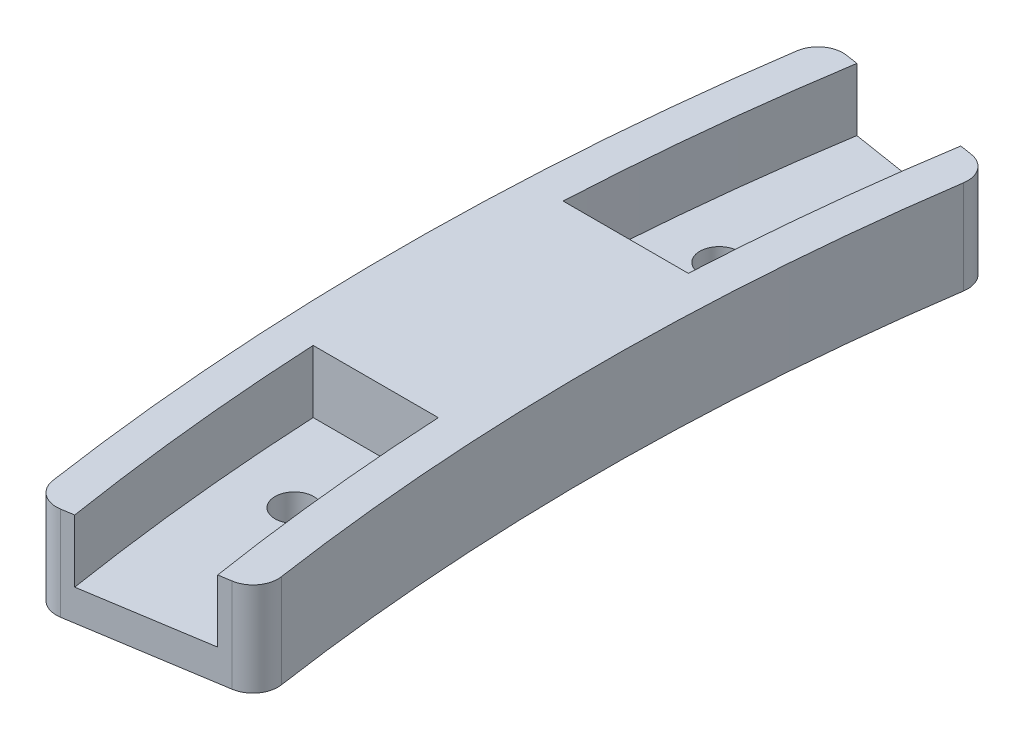
ISO-10303-21;
HEADER;
FILE_DESCRIPTION(('STEP AP214'),'2;1');
FILE_NAME('part.step','',(''),(''),'','','');
FILE_SCHEMA(('AUTOMOTIVE_DESIGN { 1 0 10303 214 1 1 1 1 }'));
ENDSEC;
DATA;
#1=APPLICATION_CONTEXT('core data for automotive mechanical design processes');
#2=APPLICATION_PROTOCOL_DEFINITION('international standard','automotive_design',2000,#1);
#3=PRODUCT_CONTEXT('',#1,'mechanical');
#4=PRODUCT('Part','Part','',(#3));
#5=PRODUCT_RELATED_PRODUCT_CATEGORY('part','',(#4));
#6=PRODUCT_DEFINITION_FORMATION('','',#4);
#7=PRODUCT_DEFINITION_CONTEXT('part definition',#1,'design');
#8=PRODUCT_DEFINITION('design','',#6,#7);
#9=PRODUCT_DEFINITION_SHAPE('','',#8);
#10=(LENGTH_UNIT() NAMED_UNIT(*) SI_UNIT(.MILLI.,.METRE.));
#11=(NAMED_UNIT(*) PLANE_ANGLE_UNIT() SI_UNIT($,.RADIAN.));
#12=(NAMED_UNIT(*) SI_UNIT($,.STERADIAN.) SOLID_ANGLE_UNIT());
#13=UNCERTAINTY_MEASURE_WITH_UNIT(LENGTH_MEASURE(1.E-05),#10,'distance_accuracy_value','');
#14=(GEOMETRIC_REPRESENTATION_CONTEXT(3) GLOBAL_UNCERTAINTY_ASSIGNED_CONTEXT((#13)) GLOBAL_UNIT_ASSIGNED_CONTEXT((#10,
#11,#12)) REPRESENTATION_CONTEXT('',''));
#15=CARTESIAN_POINT('',(0.,0.,0.));
#16=DIRECTION('',(0.,0.,1.));
#17=DIRECTION('',(1.,0.,0.));
#18=AXIS2_PLACEMENT_3D('',#15,#16,#17);
#19=CARTESIAN_POINT('',(0.,10.,0.));
#20=DIRECTION('',(0.156434465040231,0.,0.987688340595138));
#21=DIRECTION('',(0.987688340595138,0.,-0.156434465040231));
#22=AXIS2_PLACEMENT_3D('',#19,#20,#21);
#23=PLANE('',#22);
#24=DIRECTION('',(0.,1.,0.));
#25=VECTOR('',#24,1.);
#26=CARTESIAN_POINT('',(-198.515528471673,0.,31.4417708727155));
#27=LINE('',#26,#25);
#28=CARTESIAN_POINT('',(-198.515528471673,10.,31.4417708727155));
#29=VERTEX_POINT('',#28);
#30=CARTESIAN_POINT('',(-198.515528471673,2.5,31.4417708727155));
#31=VERTEX_POINT('',#30);
#32=EDGE_CURVE('E11',#29,#31,#27,.F.);
#33=ORIENTED_EDGE('',*,*,#32,.T.);
#34=DIRECTION('',(-0.987688340595138,0.,0.15643446504023));
#35=VECTOR('',#34,1.);
#36=CARTESIAN_POINT('',(-186.662644351399,2.5,29.5644584550944));
#37=LINE('',#36,#35);
#38=CARTESIAN_POINT('',(-186.662644351399,2.5,29.5644584550944));
#39=VERTEX_POINT('',#38);
#40=EDGE_CURVE('E154',#39,#31,#37,.T.);
#41=ORIENTED_EDGE('',*,*,#40,.F.);
#42=DIRECTION('',(0.,-1.,0.));
#43=VECTOR('',#42,1.);
#44=CARTESIAN_POINT('',(-186.662644351399,10.,29.5644584550944));
#45=LINE('',#44,#43);
#46=CARTESIAN_POINT('',(-186.662644351399,10.,29.5644584550944));
#47=VERTEX_POINT('',#46);
#48=EDGE_CURVE('E43',#39,#47,#45,.F.);
#49=ORIENTED_EDGE('',*,*,#48,.T.);
#50=DIRECTION('',(-0.987688340595138,0.,0.156434465040231));
#51=VECTOR('',#50,1.);
#52=CARTESIAN_POINT('',(0.,10.,0.));
#53=LINE('',#52,#51);
#54=CARTESIAN_POINT('',(-187.660784713076,10.,29.7225483576439));
#55=VERTEX_POINT('',#54);
#56=EDGE_CURVE('E198',#47,#55,#53,.T.);
#57=ORIENTED_EDGE('',*,*,#56,.T.);
#58=DIRECTION('',(0.,1.,0.));
#59=VECTOR('',#58,1.);
#60=CARTESIAN_POINT('',(-187.660784713076,5.,29.7225483576439));
#61=LINE('',#60,#59);
#62=CARTESIAN_POINT('',(-187.660784713076,5.,29.7225483576439));
#63=VERTEX_POINT('',#62);
#64=EDGE_CURVE('E249',#63,#55,#61,.T.);
#65=ORIENTED_EDGE('',*,*,#64,.F.);
#66=DIRECTION('',(0.987688340595138,0.,-0.156434465040231));
#67=VECTOR('',#66,1.);
#68=CARTESIAN_POINT('',(0.,5.,0.));
#69=LINE('',#68,#67);
#70=CARTESIAN_POINT('',(-197.537668119027,5.,31.2868930080462));
#71=VERTEX_POINT('',#70);
#72=EDGE_CURVE('E268',#71,#63,#69,.T.);
#73=ORIENTED_EDGE('',*,*,#72,.F.);
#74=DIRECTION('',(0.,1.,0.));
#75=VECTOR('',#74,1.);
#76=CARTESIAN_POINT('',(-197.537668119027,5.,31.2868930080462));
#77=LINE('',#76,#75);
#78=CARTESIAN_POINT('',(-197.537668119027,10.,31.2868930080462));
#79=VERTEX_POINT('',#78);
#80=EDGE_CURVE('E280',#71,#79,#77,.T.);
#81=ORIENTED_EDGE('',*,*,#80,.T.);
#82=EDGE_CURVE('E208',#79,#29,#53,.T.);
#83=ORIENTED_EDGE('',*,*,#82,.T.);
#84=EDGE_LOOP('',(#33,#41,#49,#57,#65,#73,#81,#83));
#85=FACE_BOUND('',#84,.T.);
#86=ADVANCED_FACE('F35',(#85),#23,.T.);
#87=CARTESIAN_POINT('',(0.,10.,0.));
#88=DIRECTION('',(0.156434465040232,0.,-0.987688340595138));
#89=DIRECTION('',(-0.987688340595138,0.,-0.156434465040232));
#90=AXIS2_PLACEMENT_3D('',#87,#88,#89);
#91=PLANE('',#90);
#92=DIRECTION('',(0.,-1.,0.));
#93=VECTOR('',#92,1.);
#94=CARTESIAN_POINT('',(-186.662644351399,10.,-29.5644584550945));
#95=LINE('',#94,#93);
#96=CARTESIAN_POINT('',(-186.662644351399,10.,-29.5644584550945));
#97=VERTEX_POINT('',#96);
#98=CARTESIAN_POINT('',(-186.662644351399,2.5,-29.5644584550945));
#99=VERTEX_POINT('',#98);
#100=EDGE_CURVE('E175',#97,#99,#95,.T.);
#101=ORIENTED_EDGE('',*,*,#100,.T.);
#102=DIRECTION('',(0.987688340595138,0.,0.156434465040232));
#103=VECTOR('',#102,1.);
#104=CARTESIAN_POINT('',(-198.515528471673,2.5,-31.4417708727157));
#105=LINE('',#104,#103);
#106=CARTESIAN_POINT('',(-198.515528471673,2.5,-31.4417708727157));
#107=VERTEX_POINT('',#106);
#108=EDGE_CURVE('E467',#107,#99,#105,.T.);
#109=ORIENTED_EDGE('',*,*,#108,.F.);
#110=DIRECTION('',(0.,1.,0.));
#111=VECTOR('',#110,1.);
#112=CARTESIAN_POINT('',(-198.515528471673,10.,-31.4417708727156));
#113=LINE('',#112,#111);
#114=CARTESIAN_POINT('',(-198.515528471673,10.,-31.4417708727157));
#115=VERTEX_POINT('',#114);
#116=EDGE_CURVE('E183',#107,#115,#113,.T.);
#117=ORIENTED_EDGE('',*,*,#116,.T.);
#118=DIRECTION('',(0.987688340595138,0.,0.156434465040232));
#119=VECTOR('',#118,1.);
#120=CARTESIAN_POINT('',(0.,10.,0.));
#121=LINE('',#120,#119);
#122=CARTESIAN_POINT('',(-197.537668119028,10.,-31.2868930080463));
#123=VERTEX_POINT('',#122);
#124=EDGE_CURVE('E177',#115,#123,#121,.T.);
#125=ORIENTED_EDGE('',*,*,#124,.T.);
#126=DIRECTION('',(0.,1.,0.));
#127=VECTOR('',#126,1.);
#128=CARTESIAN_POINT('',(-197.537668119028,5.,-31.2868930080463));
#129=LINE('',#128,#127);
#130=CARTESIAN_POINT('',(-197.537668119028,5.,-31.2868930080463));
#131=VERTEX_POINT('',#130);
#132=EDGE_CURVE('E225',#131,#123,#129,.T.);
#133=ORIENTED_EDGE('',*,*,#132,.F.);
#134=DIRECTION('',(-0.987688340595138,0.,-0.156434465040232));
#135=VECTOR('',#134,1.);
#136=CARTESIAN_POINT('',(0.,5.,0.));
#137=LINE('',#136,#135);
#138=CARTESIAN_POINT('',(-187.660784713076,5.,-29.722548357644));
#139=VERTEX_POINT('',#138);
#140=EDGE_CURVE('E255',#139,#131,#137,.T.);
#141=ORIENTED_EDGE('',*,*,#140,.F.);
#142=DIRECTION('',(0.,1.,0.));
#143=VECTOR('',#142,1.);
#144=CARTESIAN_POINT('',(-187.660784713076,5.,-29.722548357644));
#145=LINE('',#144,#143);
#146=CARTESIAN_POINT('',(-187.660784713076,10.,-29.722548357644));
#147=VERTEX_POINT('',#146);
#148=EDGE_CURVE('E256',#139,#147,#145,.T.);
#149=ORIENTED_EDGE('',*,*,#148,.T.);
#150=EDGE_CURVE('E216',#147,#97,#121,.T.);
#151=ORIENTED_EDGE('',*,*,#150,.T.);
#152=EDGE_LOOP('',(#101,#109,#117,#125,#133,#141,#149,#151));
#153=FACE_BOUND('',#152,.T.);
#154=ADVANCED_FACE('F223',(#153),#91,.T.);
#155=CARTESIAN_POINT('',(0.,10.,0.));
#156=DIRECTION('',(0.,-1.,0.));
#157=DIRECTION('',(0.,0.,-1.));
#158=AXIS2_PLACEMENT_3D('',#155,#156,#157);
#159=CYLINDRICAL_SURFACE('',#158,187.);
#160=DIRECTION('',(0.,-1.,0.));
#161=VECTOR('',#160,1.);
#162=CARTESIAN_POINT('',(-184.996936421358,10.,27.2971338186247));
#163=LINE('',#162,#161);
#164=CARTESIAN_POINT('',(-184.996936421358,10.,27.2971338186247));
#165=VERTEX_POINT('',#164);
#166=CARTESIAN_POINT('',(-184.996936421358,2.5,27.2971338186247));
#167=VERTEX_POINT('',#166);
#168=EDGE_CURVE('E191',#165,#167,#163,.T.);
#169=ORIENTED_EDGE('',*,*,#168,.T.);
#170=CARTESIAN_POINT('',(0.,2.5,0.));
#171=DIRECTION('',(0.,1.,0.));
#172=DIRECTION('',(0.,0.,-1.));
#173=AXIS2_PLACEMENT_3D('',#170,#171,#172);
#174=CIRCLE('',#173,187.);
#175=CARTESIAN_POINT('',(-184.996936421358,2.5,-27.2971338186248));
#176=VERTEX_POINT('',#175);
#177=EDGE_CURVE('E50',#176,#167,#174,.T.);
#178=ORIENTED_EDGE('',*,*,#177,.F.);
#179=DIRECTION('',(0.,-1.,0.));
#180=VECTOR('',#179,1.);
#181=CARTESIAN_POINT('',(-184.996936421358,10.,-27.2971338186248));
#182=LINE('',#181,#180);
#183=CARTESIAN_POINT('',(-184.996936421358,10.,-27.2971338186248));
#184=VERTEX_POINT('',#183);
#185=EDGE_CURVE('E194',#176,#184,#182,.F.);
#186=ORIENTED_EDGE('',*,*,#185,.T.);
#187=CARTESIAN_POINT('',(0.,10.,0.));
#188=DIRECTION('',(0.,1.,0.));
#189=DIRECTION('',(0.,0.,1.));
#190=AXIS2_PLACEMENT_3D('',#187,#188,#189);
#191=CIRCLE('',#190,187.);
#192=EDGE_CURVE('E207',#184,#165,#191,.T.);
#193=ORIENTED_EDGE('',*,*,#192,.T.);
#194=EDGE_LOOP('',(#169,#178,#186,#193));
#195=FACE_BOUND('',#194,.T.);
#196=ADVANCED_FACE('F213',(#195),#159,.F.);
#197=CARTESIAN_POINT('',(0.,10.,0.));
#198=DIRECTION('',(0.,-1.,0.));
#199=DIRECTION('',(0.,0.,-1.));
#200=AXIS2_PLACEMENT_3D('',#197,#198,#199);
#201=CYLINDRICAL_SURFACE('',#200,203.);
#202=CARTESIAN_POINT('',(0.,2.5,0.));
#203=DIRECTION('',(0.,-1.,0.));
#204=DIRECTION('',(0.,0.,-1.));
#205=AXIS2_PLACEMENT_3D('',#202,#203,#204);
#206=CIRCLE('',#205,203.);
#207=CARTESIAN_POINT('',(-200.806789415701,2.5,29.7595921436797));
#208=VERTEX_POINT('',#207);
#209=CARTESIAN_POINT('',(-200.806789415701,2.5,-29.7595921436798));
#210=VERTEX_POINT('',#209);
#211=EDGE_CURVE('E151',#208,#210,#206,.T.);
#212=ORIENTED_EDGE('',*,*,#211,.F.);
#213=DIRECTION('',(0.,-1.,0.));
#214=VECTOR('',#213,1.);
#215=CARTESIAN_POINT('',(-200.806789415701,10.,29.7595921436797));
#216=LINE('',#215,#214);
#217=CARTESIAN_POINT('',(-200.806789415701,10.,29.7595921436797));
#218=VERTEX_POINT('',#217);
#219=EDGE_CURVE('E164',#208,#218,#216,.F.);
#220=ORIENTED_EDGE('',*,*,#219,.T.);
#221=CARTESIAN_POINT('',(0.,10.,0.));
#222=DIRECTION('',(0.,1.,0.));
#223=DIRECTION('',(0.,0.,1.));
#224=AXIS2_PLACEMENT_3D('',#221,#222,#223);
#225=CIRCLE('',#224,203.);
#226=CARTESIAN_POINT('',(-200.806789415701,10.,-29.7595921436798));
#227=VERTEX_POINT('',#226);
#228=EDGE_CURVE('E173',#227,#218,#225,.T.);
#229=ORIENTED_EDGE('',*,*,#228,.F.);
#230=DIRECTION('',(0.,-1.,0.));
#231=VECTOR('',#230,1.);
#232=CARTESIAN_POINT('',(-200.806789415701,10.,-29.7595921436798));
#233=LINE('',#232,#231);
#234=EDGE_CURVE('E167',#227,#210,#233,.T.);
#235=ORIENTED_EDGE('',*,*,#234,.T.);
#236=EDGE_LOOP('',(#212,#220,#229,#235));
#237=FACE_BOUND('',#236,.T.);
#238=ADVANCED_FACE('F162',(#237),#201,.T.);
#239=CARTESIAN_POINT('',(-198.828397401754,10.,-29.4663941915254));
#240=DIRECTION('',(0.,-1.,0.));
#241=DIRECTION('',(0.,0.,-1.));
#242=AXIS2_PLACEMENT_3D('',#239,#240,#241);
#243=CYLINDRICAL_SURFACE('',#242,2.);
#244=ORIENTED_EDGE('',*,*,#116,.F.);
#245=CARTESIAN_POINT('',(-198.828397401754,2.5,-29.4663941915254));
#246=DIRECTION('',(0.,-1.,0.));
#247=DIRECTION('',(0.,0.,-1.));
#248=AXIS2_PLACEMENT_3D('',#245,#246,#247);
#249=CIRCLE('',#248,2.00000000000001);
#250=EDGE_CURVE('E168',#210,#107,#249,.T.);
#251=ORIENTED_EDGE('',*,*,#250,.F.);
#252=ORIENTED_EDGE('',*,*,#234,.F.);
#253=CARTESIAN_POINT('',(-198.828397401754,10.,-29.4663941915254));
#254=DIRECTION('',(0.,1.,0.));
#255=DIRECTION('',(0.,0.,1.));
#256=AXIS2_PLACEMENT_3D('',#253,#254,#255);
#257=CIRCLE('',#256,2.);
#258=EDGE_CURVE('E189',#115,#227,#257,.T.);
#259=ORIENTED_EDGE('',*,*,#258,.F.);
#260=EDGE_LOOP('',(#244,#251,#252,#259));
#261=FACE_BOUND('',#260,.T.);
#262=ADVANCED_FACE('F315',(#261),#243,.T.);
#263=CARTESIAN_POINT('',(-186.97551328148,10.,-27.5890817739042));
#264=DIRECTION('',(0.,-1.,0.));
#265=DIRECTION('',(0.,0.,-1.));
#266=AXIS2_PLACEMENT_3D('',#263,#264,#265);
#267=CYLINDRICAL_SURFACE('',#266,2.);
#268=ORIENTED_EDGE('',*,*,#185,.F.);
#269=CARTESIAN_POINT('',(-186.97551328148,2.5,-27.5890817739042));
#270=DIRECTION('',(0.,-1.,0.));
#271=DIRECTION('',(0.,0.,-1.));
#272=AXIS2_PLACEMENT_3D('',#269,#270,#271);
#273=CIRCLE('',#272,2.);
#274=EDGE_CURVE('E469',#99,#176,#273,.T.);
#275=ORIENTED_EDGE('',*,*,#274,.F.);
#276=ORIENTED_EDGE('',*,*,#100,.F.);
#277=CARTESIAN_POINT('',(-186.97551328148,10.,-27.5890817739042));
#278=DIRECTION('',(0.,1.,0.));
#279=DIRECTION('',(0.,0.,1.));
#280=AXIS2_PLACEMENT_3D('',#277,#278,#279);
#281=CIRCLE('',#280,2.);
#282=EDGE_CURVE('E187',#184,#97,#281,.T.);
#283=ORIENTED_EDGE('',*,*,#282,.F.);
#284=EDGE_LOOP('',(#268,#275,#276,#283));
#285=FACE_BOUND('',#284,.T.);
#286=ADVANCED_FACE('F318',(#285),#267,.T.);
#287=CARTESIAN_POINT('',(-198.828397401754,10.,29.4663941915252));
#288=DIRECTION('',(0.,-1.,0.));
#289=DIRECTION('',(0.,0.,-1.));
#290=AXIS2_PLACEMENT_3D('',#287,#288,#289);
#291=CYLINDRICAL_SURFACE('',#290,2.);
#292=ORIENTED_EDGE('',*,*,#219,.F.);
#293=CARTESIAN_POINT('',(-198.828397401754,2.5,29.4663941915252));
#294=DIRECTION('',(0.,-1.,0.));
#295=DIRECTION('',(0.,0.,-1.));
#296=AXIS2_PLACEMENT_3D('',#293,#294,#295);
#297=CIRCLE('',#296,2.00000000000001);
#298=EDGE_CURVE('E148',#31,#208,#297,.T.);
#299=ORIENTED_EDGE('',*,*,#298,.F.);
#300=ORIENTED_EDGE('',*,*,#32,.F.);
#301=CARTESIAN_POINT('',(-198.828397401754,10.,29.4663941915252));
#302=DIRECTION('',(0.,1.,0.));
#303=DIRECTION('',(0.,0.,1.));
#304=AXIS2_PLACEMENT_3D('',#301,#302,#303);
#305=CIRCLE('',#304,2.);
#306=EDGE_CURVE('E172',#218,#29,#305,.T.);
#307=ORIENTED_EDGE('',*,*,#306,.F.);
#308=EDGE_LOOP('',(#292,#299,#300,#307));
#309=FACE_BOUND('',#308,.T.);
#310=ADVANCED_FACE('F171',(#309),#291,.T.);
#311=CARTESIAN_POINT('',(-186.97551328148,10.,27.5890817739041));
#312=DIRECTION('',(0.,-1.,0.));
#313=DIRECTION('',(0.,0.,-1.));
#314=AXIS2_PLACEMENT_3D('',#311,#312,#313);
#315=CYLINDRICAL_SURFACE('',#314,2.);
#316=ORIENTED_EDGE('',*,*,#48,.F.);
#317=CARTESIAN_POINT('',(-186.97551328148,2.5,27.5890817739041));
#318=DIRECTION('',(0.,-1.,0.));
#319=DIRECTION('',(0.,0.,-1.));
#320=AXIS2_PLACEMENT_3D('',#317,#318,#319);
#321=CIRCLE('',#320,2.00000000000002);
#322=EDGE_CURVE('E211',#167,#39,#321,.T.);
#323=ORIENTED_EDGE('',*,*,#322,.F.);
#324=ORIENTED_EDGE('',*,*,#168,.F.);
#325=CARTESIAN_POINT('',(-186.97551328148,10.,27.5890817739041));
#326=DIRECTION('',(0.,1.,0.));
#327=DIRECTION('',(0.,0.,1.));
#328=AXIS2_PLACEMENT_3D('',#325,#326,#327);
#329=CIRCLE('',#328,2.);
#330=EDGE_CURVE('E58',#47,#165,#329,.T.);
#331=ORIENTED_EDGE('',*,*,#330,.F.);
#332=EDGE_LOOP('',(#316,#323,#324,#331));
#333=FACE_BOUND('',#332,.T.);
#334=ADVANCED_FACE('F37',(#333),#315,.T.);
#335=CARTESIAN_POINT('',(0.,10.,0.));
#336=DIRECTION('',(0.,1.,0.));
#337=DIRECTION('',(0.,0.,1.));
#338=AXIS2_PLACEMENT_3D('',#335,#336,#337);
#339=PLANE('',#338);
#340=ORIENTED_EDGE('',*,*,#124,.F.);
#341=ORIENTED_EDGE('',*,*,#258,.T.);
#342=ORIENTED_EDGE('',*,*,#228,.T.);
#343=ORIENTED_EDGE('',*,*,#306,.T.);
#344=ORIENTED_EDGE('',*,*,#82,.F.);
#345=CARTESIAN_POINT('',(0.,10.,0.));
#346=DIRECTION('',(0.,1.,0.));
#347=DIRECTION('',(0.,0.,1.));
#348=AXIS2_PLACEMENT_3D('',#345,#346,#347);
#349=CIRCLE('',#348,200.);
#350=CARTESIAN_POINT('',(-199.749843554382,10.,10.));
#351=VERTEX_POINT('',#350);
#352=EDGE_CURVE('E276',#351,#79,#349,.T.);
#353=ORIENTED_EDGE('',*,*,#352,.F.);
#354=DIRECTION('',(-1.,0.,0.));
#355=VECTOR('',#354,1.);
#356=CARTESIAN_POINT('',(0.,10.,10.));
#357=LINE('',#356,#355);
#358=CARTESIAN_POINT('',(-189.736659610103,10.,10.));
#359=VERTEX_POINT('',#358);
#360=EDGE_CURVE('E274',#359,#351,#357,.T.);
#361=ORIENTED_EDGE('',*,*,#360,.F.);
#362=CARTESIAN_POINT('',(0.,10.,0.));
#363=DIRECTION('',(0.,1.,0.));
#364=DIRECTION('',(0.,0.,1.));
#365=AXIS2_PLACEMENT_3D('',#362,#363,#364);
#366=CIRCLE('',#365,190.);
#367=EDGE_CURVE('E206',#359,#55,#366,.T.);
#368=ORIENTED_EDGE('',*,*,#367,.T.);
#369=ORIENTED_EDGE('',*,*,#56,.F.);
#370=ORIENTED_EDGE('',*,*,#330,.T.);
#371=ORIENTED_EDGE('',*,*,#192,.F.);
#372=ORIENTED_EDGE('',*,*,#282,.T.);
#373=ORIENTED_EDGE('',*,*,#150,.F.);
#374=CARTESIAN_POINT('',(0.,10.,0.));
#375=DIRECTION('',(0.,1.,0.));
#376=DIRECTION('',(0.,0.,1.));
#377=AXIS2_PLACEMENT_3D('',#374,#375,#376);
#378=CIRCLE('',#377,190.);
#379=CARTESIAN_POINT('',(-189.736659610103,10.,-9.99999999999999));
#380=VERTEX_POINT('',#379);
#381=EDGE_CURVE('E247',#147,#380,#378,.T.);
#382=ORIENTED_EDGE('',*,*,#381,.T.);
#383=DIRECTION('',(-1.,0.,0.));
#384=VECTOR('',#383,1.);
#385=CARTESIAN_POINT('',(0.,10.,-10.));
#386=LINE('',#385,#384);
#387=CARTESIAN_POINT('',(-199.749843554382,10.,-9.99999999999999));
#388=VERTEX_POINT('',#387);
#389=EDGE_CURVE('E244',#380,#388,#386,.T.);
#390=ORIENTED_EDGE('',*,*,#389,.T.);
#391=CARTESIAN_POINT('',(0.,10.,0.));
#392=DIRECTION('',(0.,1.,0.));
#393=DIRECTION('',(0.,0.,1.));
#394=AXIS2_PLACEMENT_3D('',#391,#392,#393);
#395=CIRCLE('',#394,200.);
#396=EDGE_CURVE('E234',#123,#388,#395,.T.);
#397=ORIENTED_EDGE('',*,*,#396,.F.);
#398=EDGE_LOOP('',(#340,#341,#342,#343,#344,#353,#361,#368,#369,#370,#371,#372,#373,#382,#390,#397));
#399=FACE_BOUND('',#398,.T.);
#400=ADVANCED_FACE('F203',(#399),#339,.T.);
#401=CARTESIAN_POINT('',(0.,5.,10.));
#402=DIRECTION('',(0.,0.,-1.));
#403=DIRECTION('',(-1.,0.,0.));
#404=AXIS2_PLACEMENT_3D('',#401,#402,#403);
#405=PLANE('',#404);
#406=ORIENTED_EDGE('',*,*,#360,.T.);
#407=DIRECTION('',(0.,1.,0.));
#408=VECTOR('',#407,1.);
#409=CARTESIAN_POINT('',(-199.749843554382,5.,10.));
#410=LINE('',#409,#408);
#411=CARTESIAN_POINT('',(-199.749843554382,5.,10.));
#412=VERTEX_POINT('',#411);
#413=EDGE_CURVE('E273',#412,#351,#410,.T.);
#414=ORIENTED_EDGE('',*,*,#413,.F.);
#415=DIRECTION('',(-1.,0.,0.));
#416=VECTOR('',#415,1.);
#417=CARTESIAN_POINT('',(0.,5.,10.));
#418=LINE('',#417,#416);
#419=CARTESIAN_POINT('',(-189.736659610103,5.,10.));
#420=VERTEX_POINT('',#419);
#421=EDGE_CURVE('E262',#420,#412,#418,.T.);
#422=ORIENTED_EDGE('',*,*,#421,.F.);
#423=DIRECTION('',(0.,1.,0.));
#424=VECTOR('',#423,1.);
#425=CARTESIAN_POINT('',(-189.736659610103,5.,10.));
#426=LINE('',#425,#424);
#427=EDGE_CURVE('E245',#420,#359,#426,.T.);
#428=ORIENTED_EDGE('',*,*,#427,.T.);
#429=EDGE_LOOP('',(#406,#414,#422,#428));
#430=FACE_BOUND('',#429,.T.);
#431=ADVANCED_FACE('F295',(#430),#405,.F.);
#432=CARTESIAN_POINT('',(0.,5.,0.));
#433=DIRECTION('',(0.,1.,0.));
#434=DIRECTION('',(0.,0.,1.));
#435=AXIS2_PLACEMENT_3D('',#432,#433,#434);
#436=CYLINDRICAL_SURFACE('',#435,190.);
#437=ORIENTED_EDGE('',*,*,#367,.F.);
#438=ORIENTED_EDGE('',*,*,#427,.F.);
#439=CARTESIAN_POINT('',(0.,5.,0.));
#440=DIRECTION('',(0.,1.,0.));
#441=DIRECTION('',(0.,0.,1.));
#442=AXIS2_PLACEMENT_3D('',#439,#440,#441);
#443=CIRCLE('',#442,190.);
#444=EDGE_CURVE('E271',#420,#63,#443,.T.);
#445=ORIENTED_EDGE('',*,*,#444,.T.);
#446=ORIENTED_EDGE('',*,*,#64,.T.);
#447=EDGE_LOOP('',(#437,#438,#445,#446));
#448=FACE_BOUND('',#447,.T.);
#449=ADVANCED_FACE('F297',(#448),#436,.T.);
#450=CARTESIAN_POINT('',(0.,5.,0.));
#451=DIRECTION('',(0.,1.,0.));
#452=DIRECTION('',(0.,0.,1.));
#453=AXIS2_PLACEMENT_3D('',#450,#451,#452);
#454=CYLINDRICAL_SURFACE('',#453,200.);
#455=ORIENTED_EDGE('',*,*,#352,.T.);
#456=ORIENTED_EDGE('',*,*,#80,.F.);
#457=CARTESIAN_POINT('',(0.,5.,0.));
#458=DIRECTION('',(0.,1.,0.));
#459=DIRECTION('',(0.,0.,1.));
#460=AXIS2_PLACEMENT_3D('',#457,#458,#459);
#461=CIRCLE('',#460,200.);
#462=EDGE_CURVE('E265',#412,#71,#461,.T.);
#463=ORIENTED_EDGE('',*,*,#462,.F.);
#464=ORIENTED_EDGE('',*,*,#413,.T.);
#465=EDGE_LOOP('',(#455,#456,#463,#464));
#466=FACE_BOUND('',#465,.T.);
#467=ADVANCED_FACE('F286',(#466),#454,.F.);
#468=CARTESIAN_POINT('',(0.,5.,0.));
#469=DIRECTION('',(0.,1.,0.));
#470=DIRECTION('',(0.,0.,1.));
#471=AXIS2_PLACEMENT_3D('',#468,#469,#470);
#472=PLANE('',#471);
#473=CARTESIAN_POINT('',(-194.25796612789,5.,16.9953698357934));
#474=DIRECTION('',(0.,1.,0.));
#475=DIRECTION('',(0.,0.,1.));
#476=AXIS2_PLACEMENT_3D('',#473,#474,#475);
#477=CIRCLE('',#476,1.55);
#478=CARTESIAN_POINT('',(-194.25796612789,5.,18.5453698357934));
#479=VERTEX_POINT('',#478);
#480=EDGE_CURVE('E158',#479,#479,#477,.T.);
#481=ORIENTED_EDGE('',*,*,#480,.F.);
#482=EDGE_LOOP('',(#481));
#483=FACE_BOUND('',#482,.T.);
#484=ORIENTED_EDGE('',*,*,#421,.T.);
#485=ORIENTED_EDGE('',*,*,#462,.T.);
#486=ORIENTED_EDGE('',*,*,#72,.T.);
#487=ORIENTED_EDGE('',*,*,#444,.F.);
#488=EDGE_LOOP('',(#484,#485,#486,#487));
#489=FACE_BOUND('',#488,.T.);
#490=ADVANCED_FACE('F293',(#483,#489),#472,.T.);
#491=CARTESIAN_POINT('',(0.,5.,0.));
#492=DIRECTION('',(0.,1.,0.));
#493=DIRECTION('',(0.,0.,1.));
#494=AXIS2_PLACEMENT_3D('',#491,#492,#493);
#495=CYLINDRICAL_SURFACE('',#494,190.);
#496=ORIENTED_EDGE('',*,*,#381,.F.);
#497=ORIENTED_EDGE('',*,*,#148,.F.);
#498=CARTESIAN_POINT('',(0.,5.,0.));
#499=DIRECTION('',(0.,1.,0.));
#500=DIRECTION('',(0.,0.,1.));
#501=AXIS2_PLACEMENT_3D('',#498,#499,#500);
#502=CIRCLE('',#501,190.);
#503=CARTESIAN_POINT('',(-189.736659610103,5.,-9.99999999999999));
#504=VERTEX_POINT('',#503);
#505=EDGE_CURVE('E240',#139,#504,#502,.T.);
#506=ORIENTED_EDGE('',*,*,#505,.T.);
#507=DIRECTION('',(0.,1.,0.));
#508=VECTOR('',#507,1.);
#509=CARTESIAN_POINT('',(-189.736659610103,5.,-9.99999999999999));
#510=LINE('',#509,#508);
#511=EDGE_CURVE('E259',#504,#380,#510,.T.);
#512=ORIENTED_EDGE('',*,*,#511,.T.);
#513=EDGE_LOOP('',(#496,#497,#506,#512));
#514=FACE_BOUND('',#513,.T.);
#515=ADVANCED_FACE('F377',(#514),#495,.T.);
#516=CARTESIAN_POINT('',(0.,5.,-10.));
#517=DIRECTION('',(0.,0.,-1.));
#518=DIRECTION('',(-1.,0.,0.));
#519=AXIS2_PLACEMENT_3D('',#516,#517,#518);
#520=PLANE('',#519);
#521=ORIENTED_EDGE('',*,*,#389,.F.);
#522=ORIENTED_EDGE('',*,*,#511,.F.);
#523=DIRECTION('',(-1.,0.,0.));
#524=VECTOR('',#523,1.);
#525=CARTESIAN_POINT('',(0.,5.,-10.));
#526=LINE('',#525,#524);
#527=CARTESIAN_POINT('',(-199.749843554382,5.,-9.99999999999999));
#528=VERTEX_POINT('',#527);
#529=EDGE_CURVE('E475',#504,#528,#526,.T.);
#530=ORIENTED_EDGE('',*,*,#529,.T.);
#531=DIRECTION('',(0.,1.,0.));
#532=VECTOR('',#531,1.);
#533=CARTESIAN_POINT('',(-199.749843554382,5.,-9.99999999999999));
#534=LINE('',#533,#532);
#535=EDGE_CURVE('E239',#528,#388,#534,.T.);
#536=ORIENTED_EDGE('',*,*,#535,.T.);
#537=EDGE_LOOP('',(#521,#522,#530,#536));
#538=FACE_BOUND('',#537,.T.);
#539=ADVANCED_FACE('F366',(#538),#520,.T.);
#540=CARTESIAN_POINT('',(0.,5.,0.));
#541=DIRECTION('',(0.,1.,0.));
#542=DIRECTION('',(0.,0.,1.));
#543=AXIS2_PLACEMENT_3D('',#540,#541,#542);
#544=CYLINDRICAL_SURFACE('',#543,200.);
#545=ORIENTED_EDGE('',*,*,#396,.T.);
#546=ORIENTED_EDGE('',*,*,#535,.F.);
#547=CARTESIAN_POINT('',(0.,5.,0.));
#548=DIRECTION('',(0.,1.,0.));
#549=DIRECTION('',(0.,0.,1.));
#550=AXIS2_PLACEMENT_3D('',#547,#548,#549);
#551=CIRCLE('',#550,200.);
#552=EDGE_CURVE('E237',#131,#528,#551,.T.);
#553=ORIENTED_EDGE('',*,*,#552,.F.);
#554=ORIENTED_EDGE('',*,*,#132,.T.);
#555=EDGE_LOOP('',(#545,#546,#553,#554));
#556=FACE_BOUND('',#555,.T.);
#557=ADVANCED_FACE('F232',(#556),#544,.F.);
#558=CARTESIAN_POINT('',(0.,5.,0.));
#559=DIRECTION('',(0.,1.,0.));
#560=DIRECTION('',(0.,0.,1.));
#561=AXIS2_PLACEMENT_3D('',#558,#559,#560);
#562=PLANE('',#561);
#563=CARTESIAN_POINT('',(-194.25796612789,5.,-16.9953698357934));
#564=DIRECTION('',(0.,1.,0.));
#565=DIRECTION('',(0.,0.,1.));
#566=AXIS2_PLACEMENT_3D('',#563,#564,#565);
#567=CIRCLE('',#566,1.55);
#568=CARTESIAN_POINT('',(-194.25796612789,5.,-15.4453698357934));
#569=VERTEX_POINT('',#568);
#570=EDGE_CURVE('E454',#569,#569,#567,.T.);
#571=ORIENTED_EDGE('',*,*,#570,.F.);
#572=EDGE_LOOP('',(#571));
#573=FACE_BOUND('',#572,.T.);
#574=ORIENTED_EDGE('',*,*,#140,.T.);
#575=ORIENTED_EDGE('',*,*,#552,.T.);
#576=ORIENTED_EDGE('',*,*,#529,.F.);
#577=ORIENTED_EDGE('',*,*,#505,.F.);
#578=EDGE_LOOP('',(#574,#575,#576,#577));
#579=FACE_BOUND('',#578,.T.);
#580=ADVANCED_FACE('F365',(#573,#579),#562,.T.);
#581=CARTESIAN_POINT('',(-198.828397401754,2.5,29.4663941915252));
#582=DIRECTION('',(0.,-1.,0.));
#583=DIRECTION('',(0.,0.,-1.));
#584=AXIS2_PLACEMENT_3D('',#581,#582,#583);
#585=PLANE('',#584);
#586=CARTESIAN_POINT('',(-194.25796612789,2.5,-16.9953698357934));
#587=DIRECTION('',(0.,-1.,0.));
#588=DIRECTION('',(0.,0.,-1.));
#589=AXIS2_PLACEMENT_3D('',#586,#587,#588);
#590=CIRCLE('',#589,1.55);
#591=CARTESIAN_POINT('',(-194.25796612789,2.5,-18.5453698357934));
#592=VERTEX_POINT('',#591);
#593=EDGE_CURVE('E457',#592,#592,#590,.T.);
#594=ORIENTED_EDGE('',*,*,#593,.F.);
#595=EDGE_LOOP('',(#594));
#596=FACE_BOUND('',#595,.T.);
#597=CARTESIAN_POINT('',(-194.25796612789,2.5,16.9953698357934));
#598=DIRECTION('',(0.,-1.,0.));
#599=DIRECTION('',(0.,0.,-1.));
#600=AXIS2_PLACEMENT_3D('',#597,#598,#599);
#601=CIRCLE('',#600,1.55);
#602=CARTESIAN_POINT('',(-194.25796612789,2.5,15.4453698357934));
#603=VERTEX_POINT('',#602);
#604=EDGE_CURVE('E459',#603,#603,#601,.T.);
#605=ORIENTED_EDGE('',*,*,#604,.F.);
#606=EDGE_LOOP('',(#605));
#607=FACE_BOUND('',#606,.T.);
#608=ORIENTED_EDGE('',*,*,#298,.T.);
#609=ORIENTED_EDGE('',*,*,#211,.T.);
#610=ORIENTED_EDGE('',*,*,#250,.T.);
#611=ORIENTED_EDGE('',*,*,#108,.T.);
#612=ORIENTED_EDGE('',*,*,#274,.T.);
#613=ORIENTED_EDGE('',*,*,#177,.T.);
#614=ORIENTED_EDGE('',*,*,#322,.T.);
#615=ORIENTED_EDGE('',*,*,#40,.T.);
#616=EDGE_LOOP('',(#608,#609,#610,#611,#612,#613,#614,#615));
#617=FACE_BOUND('',#616,.T.);
#618=ADVANCED_FACE('F150',(#596,#607,#617),#585,.T.);
#619=CARTESIAN_POINT('',(-194.25796612789,2.5,16.9953698357934));
#620=DIRECTION('',(0.,-1.,0.));
#621=DIRECTION('',(0.,0.,-1.));
#622=AXIS2_PLACEMENT_3D('',#619,#620,#621);
#623=CYLINDRICAL_SURFACE('',#622,1.55);
#624=ORIENTED_EDGE('',*,*,#480,.T.);
#625=EDGE_LOOP('',(#624));
#626=FACE_BOUND('',#625,.T.);
#627=ORIENTED_EDGE('',*,*,#604,.T.);
#628=EDGE_LOOP('',(#627));
#629=FACE_BOUND('',#628,.T.);
#630=ADVANCED_FACE('F427',(#626,#629),#623,.F.);
#631=CARTESIAN_POINT('',(-194.25796612789,2.5,-16.9953698357934));
#632=DIRECTION('',(0.,-1.,0.));
#633=DIRECTION('',(0.,0.,-1.));
#634=AXIS2_PLACEMENT_3D('',#631,#632,#633);
#635=CYLINDRICAL_SURFACE('',#634,1.55);
#636=ORIENTED_EDGE('',*,*,#570,.T.);
#637=EDGE_LOOP('',(#636));
#638=FACE_BOUND('',#637,.T.);
#639=ORIENTED_EDGE('',*,*,#593,.T.);
#640=EDGE_LOOP('',(#639));
#641=FACE_BOUND('',#640,.T.);
#642=ADVANCED_FACE('F437',(#638,#641),#635,.F.);
#643=CLOSED_SHELL('',(#86,#154,#196,#238,#262,#286,#310,#334,#400,#431,#449,#467,#490,#515,#539,
#557,#580,#618,#630,#642));
#644=MANIFOLD_SOLID_BREP('B2',#643);
#645=ADVANCED_BREP_SHAPE_REPRESENTATION('',(#18,#644),#14);
#646=SHAPE_DEFINITION_REPRESENTATION(#9,#645);
ENDSEC;
END-ISO-10303-21;
